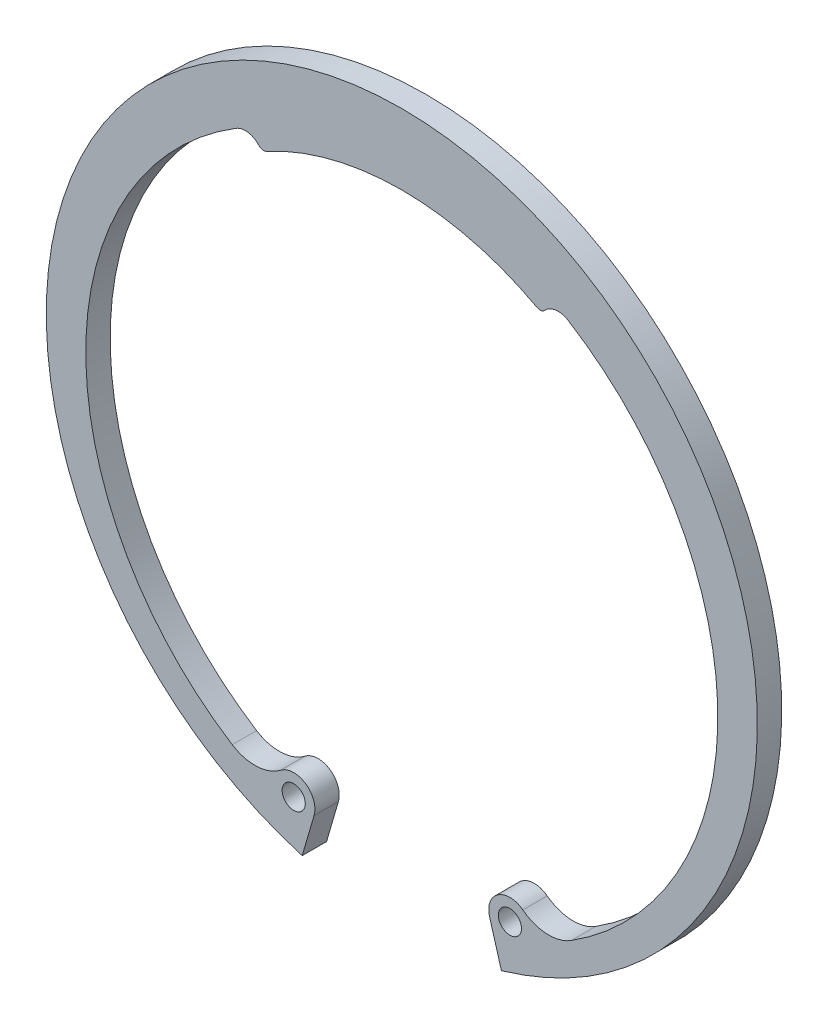
ISO-10303-21;
HEADER;
FILE_DESCRIPTION(('STEP AP214'),'2;1');
FILE_NAME('part.step','',(''),(''),'','','');
FILE_SCHEMA(('AUTOMOTIVE_DESIGN { 1 0 10303 214 1 1 1 1 }'));
ENDSEC;
DATA;
#1=APPLICATION_CONTEXT('core data for automotive mechanical design processes');
#2=APPLICATION_PROTOCOL_DEFINITION('international standard','automotive_design',2000,#1);
#3=PRODUCT_CONTEXT('',#1,'mechanical');
#4=PRODUCT('Part','Part','',(#3));
#5=PRODUCT_RELATED_PRODUCT_CATEGORY('part','',(#4));
#6=PRODUCT_DEFINITION_FORMATION('','',#4);
#7=PRODUCT_DEFINITION_CONTEXT('part definition',#1,'design');
#8=PRODUCT_DEFINITION('design','',#6,#7);
#9=PRODUCT_DEFINITION_SHAPE('','',#8);
#10=(LENGTH_UNIT() NAMED_UNIT(*) SI_UNIT(.MILLI.,.METRE.));
#11=(NAMED_UNIT(*) PLANE_ANGLE_UNIT() SI_UNIT($,.RADIAN.));
#12=(NAMED_UNIT(*) SI_UNIT($,.STERADIAN.) SOLID_ANGLE_UNIT());
#13=UNCERTAINTY_MEASURE_WITH_UNIT(LENGTH_MEASURE(1.E-05),#10,'distance_accuracy_value','');
#14=(GEOMETRIC_REPRESENTATION_CONTEXT(3) GLOBAL_UNCERTAINTY_ASSIGNED_CONTEXT((#13)) GLOBAL_UNIT_ASSIGNED_CONTEXT((#10,
#11,#12)) REPRESENTATION_CONTEXT('',''));
#15=CARTESIAN_POINT('',(0.,0.,0.));
#16=DIRECTION('',(0.,0.,1.));
#17=DIRECTION('',(1.,0.,0.));
#18=AXIS2_PLACEMENT_3D('',#15,#16,#17);
#19=CARTESIAN_POINT('',(0.,-2.21438908593819,4.));
#20=DIRECTION('',(0.,0.,-1.));
#21=DIRECTION('',(-1.,0.,0.));
#22=AXIS2_PLACEMENT_3D('',#19,#20,#21);
#23=CYLINDRICAL_SURFACE('',#22,51.8643890859382);
#24=CARTESIAN_POINT('',(0.,-2.21438908593819,0.));
#25=DIRECTION('',(0.,0.,-1.));
#26=DIRECTION('',(1.,0.,0.));
#27=AXIS2_PLACEMENT_3D('',#24,#25,#26);
#28=CIRCLE('',#27,51.8643890859382);
#29=CARTESIAN_POINT('',(-27.8304508915466,-45.9794534458908,0.));
#30=VERTEX_POINT('',#29);
#31=CARTESIAN_POINT('',(-27.2461818814489,41.9167838889623,0.));
#32=VERTEX_POINT('',#31);
#33=EDGE_CURVE('E249',#30,#32,#28,.T.);
#34=ORIENTED_EDGE('',*,*,#33,.T.);
#35=DIRECTION('',(0.,0.,-1.));
#36=VECTOR('',#35,1.);
#37=CARTESIAN_POINT('',(-27.2461818814489,41.9167838889623,4.));
#38=LINE('',#37,#36);
#39=CARTESIAN_POINT('',(-27.2461818814489,41.9167838889623,4.));
#40=VERTEX_POINT('',#39);
#41=EDGE_CURVE('E177',#32,#40,#38,.F.);
#42=ORIENTED_EDGE('',*,*,#41,.T.);
#43=CARTESIAN_POINT('',(0.,-2.21438908593819,4.));
#44=DIRECTION('',(0.,0.,-1.));
#45=DIRECTION('',(1.,0.,0.));
#46=AXIS2_PLACEMENT_3D('',#43,#44,#45);
#47=CIRCLE('',#46,51.8643890859382);
#48=CARTESIAN_POINT('',(-27.8304508915466,-45.9794534458908,4.));
#49=VERTEX_POINT('',#48);
#50=EDGE_CURVE('E248',#49,#40,#47,.T.);
#51=ORIENTED_EDGE('',*,*,#50,.F.);
#52=DIRECTION('',(0.,0.,-1.));
#53=VECTOR('',#52,1.);
#54=CARTESIAN_POINT('',(-27.8304508915466,-45.9794534458908,4.));
#55=LINE('',#54,#53);
#56=EDGE_CURVE('E307',#49,#30,#55,.T.);
#57=ORIENTED_EDGE('',*,*,#56,.T.);
#58=EDGE_LOOP('',(#34,#42,#51,#57));
#59=FACE_BOUND('',#58,.T.);
#60=ADVANCED_FACE('F44',(#59),#23,.F.);
#61=CARTESIAN_POINT('',(0.,0.,4.));
#62=DIRECTION('',(0.,0.,1.));
#63=DIRECTION('',(1.,0.,0.));
#64=AXIS2_PLACEMENT_3D('',#61,#62,#63);
#65=PLANE('',#64);
#66=CARTESIAN_POINT('',(17.740527432389,-48.3745729843753,4.));
#67=DIRECTION('',(0.,0.,1.));
#68=DIRECTION('',(1.,0.,0.));
#69=AXIS2_PLACEMENT_3D('',#66,#67,#68);
#70=CIRCLE('',#69,1.9);
#71=CARTESIAN_POINT('',(19.640527432389,-48.3745729843753,4.));
#72=VERTEX_POINT('',#71);
#73=EDGE_CURVE('E273',#72,#72,#70,.T.);
#74=ORIENTED_EDGE('',*,*,#73,.F.);
#75=EDGE_LOOP('',(#74));
#76=FACE_BOUND('',#75,.T.);
#77=CARTESIAN_POINT('',(-25.6701767055486,39.3640975224975,4.));
#78=DIRECTION('',(0.,0.,1.));
#79=DIRECTION('',(1.,0.,0.));
#80=AXIS2_PLACEMENT_3D('',#77,#78,#79);
#81=CIRCLE('',#80,3.);
#82=CARTESIAN_POINT('',(-23.441673777115,41.3725234479334,4.));
#83=VERTEX_POINT('',#82);
#84=EDGE_CURVE('E194',#40,#83,#81,.F.);
#85=ORIENTED_EDGE('',*,*,#84,.T.);
#86=CARTESIAN_POINT('',(-22.6988394676372,42.041998756412,4.));
#87=DIRECTION('',(0.,0.,1.));
#88=DIRECTION('',(1.,0.,0.));
#89=AXIS2_PLACEMENT_3D('',#86,#87,#88);
#90=CIRCLE('',#89,1.);
#91=CARTESIAN_POINT('',(-22.2237527779086,41.1620597600931,4.));
#92=VERTEX_POINT('',#91);
#93=EDGE_CURVE('E53',#83,#92,#90,.T.);
#94=ORIENTED_EDGE('',*,*,#93,.T.);
#95=CARTESIAN_POINT('',(0.,0.,4.));
#96=DIRECTION('',(0.,0.,1.));
#97=DIRECTION('',(1.,0.,0.));
#98=AXIS2_PLACEMENT_3D('',#95,#96,#97);
#99=CIRCLE('',#98,46.7783106923185);
#100=CARTESIAN_POINT('',(22.2237527779086,41.1620597600932,4.));
#101=VERTEX_POINT('',#100);
#102=EDGE_CURVE('E224',#101,#92,#99,.T.);
#103=ORIENTED_EDGE('',*,*,#102,.F.);
#104=CARTESIAN_POINT('',(22.6988394676372,42.0419987564121,4.));
#105=DIRECTION('',(0.,0.,1.));
#106=DIRECTION('',(1.,0.,0.));
#107=AXIS2_PLACEMENT_3D('',#104,#105,#106);
#108=CIRCLE('',#107,1.);
#109=CARTESIAN_POINT('',(23.441673777115,41.3725234479334,4.));
#110=VERTEX_POINT('',#109);
#111=EDGE_CURVE('E60',#101,#110,#108,.T.);
#112=ORIENTED_EDGE('',*,*,#111,.T.);
#113=CARTESIAN_POINT('',(25.6701767055486,39.3640975224975,4.));
#114=DIRECTION('',(0.,0.,1.));
#115=DIRECTION('',(1.,0.,0.));
#116=AXIS2_PLACEMENT_3D('',#113,#114,#115);
#117=CIRCLE('',#116,3.);
#118=CARTESIAN_POINT('',(27.2461818814489,41.9167838889623,4.));
#119=VERTEX_POINT('',#118);
#120=EDGE_CURVE('E201',#110,#119,#117,.F.);
#121=ORIENTED_EDGE('',*,*,#120,.T.);
#122=CARTESIAN_POINT('',(27.8304508915466,-45.9794534458908,4.));
#123=VERTEX_POINT('',#122);
#124=EDGE_CURVE('E255',#119,#123,#47,.T.);
#125=ORIENTED_EDGE('',*,*,#124,.T.);
#126=CARTESIAN_POINT('',(24.101078250605,-40.1147897978206,4.));
#127=DIRECTION('',(0.,0.,-1.));
#128=DIRECTION('',(1.,0.,0.));
#129=AXIS2_PLACEMENT_3D('',#126,#127,#128);
#130=CIRCLE('',#129,6.94999999999999);
#131=CARTESIAN_POINT('',(19.860711038461,-45.6213119221904,4.));
#132=VERTEX_POINT('',#131);
#133=EDGE_CURVE('E254',#123,#132,#130,.T.);
#134=ORIENTED_EDGE('',*,*,#133,.T.);
#135=CARTESIAN_POINT('',(17.740527432389,-48.3745729843753,4.));
#136=DIRECTION('',(0.,0.,1.));
#137=DIRECTION('',(1.,0.,0.));
#138=AXIS2_PLACEMENT_3D('',#135,#136,#137);
#139=CIRCLE('',#138,3.475);
#140=CARTESIAN_POINT('',(14.4047361992826,-49.3482884711221,4.));
#141=VERTEX_POINT('',#140);
#142=EDGE_CURVE('E260',#132,#141,#139,.T.);
#143=ORIENTED_EDGE('',*,*,#142,.T.);
#144=DIRECTION('',(0.280205895466689,-0.959939923196088,0.));
#145=VECTOR('',#144,1.);
#146=CARTESIAN_POINT('',(16.3500140004813,-56.0124945184917,4.));
#147=LINE('',#146,#145);
#148=CARTESIAN_POINT('',(16.3500140004813,-56.0124945184917,4.));
#149=VERTEX_POINT('',#148);
#150=EDGE_CURVE('E166',#141,#149,#147,.T.);
#151=ORIENTED_EDGE('',*,*,#150,.T.);
#152=CARTESIAN_POINT('',(0.,0.,4.));
#153=DIRECTION('',(0.,0.,1.));
#154=DIRECTION('',(1.,0.,0.));
#155=AXIS2_PLACEMENT_3D('',#152,#153,#154);
#156=CIRCLE('',#155,58.35);
#157=CARTESIAN_POINT('',(-16.3500140004813,-56.0124945184917,4.));
#158=VERTEX_POINT('',#157);
#159=EDGE_CURVE('E160',#149,#158,#156,.T.);
#160=ORIENTED_EDGE('',*,*,#159,.T.);
#161=DIRECTION('',(0.280205895466688,0.959939923196088,0.));
#162=VECTOR('',#161,1.);
#163=CARTESIAN_POINT('',(-16.3500140004813,-56.0124945184917,4.));
#164=LINE('',#163,#162);
#165=CARTESIAN_POINT('',(-14.4047361992826,-49.3482884711221,4.));
#166=VERTEX_POINT('',#165);
#167=EDGE_CURVE('E149',#158,#166,#164,.T.);
#168=ORIENTED_EDGE('',*,*,#167,.T.);
#169=CARTESIAN_POINT('',(-17.740527432389,-48.3745729843753,4.));
#170=DIRECTION('',(0.,0.,1.));
#171=DIRECTION('',(1.,0.,0.));
#172=AXIS2_PLACEMENT_3D('',#169,#170,#171);
#173=CIRCLE('',#172,3.475);
#174=CARTESIAN_POINT('',(-19.860711038461,-45.6213119221904,4.));
#175=VERTEX_POINT('',#174);
#176=EDGE_CURVE('E159',#166,#175,#173,.T.);
#177=ORIENTED_EDGE('',*,*,#176,.T.);
#178=CARTESIAN_POINT('',(-24.101078250605,-40.1147897978206,4.));
#179=DIRECTION('',(0.,0.,-1.));
#180=DIRECTION('',(1.,0.,0.));
#181=AXIS2_PLACEMENT_3D('',#178,#179,#180);
#182=CIRCLE('',#181,6.95);
#183=EDGE_CURVE('E251',#175,#49,#182,.T.);
#184=ORIENTED_EDGE('',*,*,#183,.T.);
#185=ORIENTED_EDGE('',*,*,#50,.T.);
#186=EDGE_LOOP('',(#85,#94,#103,#112,#121,#125,#134,#143,#151,#160,#168,#177,#184,#185));
#187=FACE_BOUND('',#186,.T.);
#188=CARTESIAN_POINT('',(-17.740527432389,-48.3745729843753,4.));
#189=DIRECTION('',(0.,0.,1.));
#190=DIRECTION('',(1.,0.,0.));
#191=AXIS2_PLACEMENT_3D('',#188,#189,#190);
#192=CIRCLE('',#191,1.9);
#193=CARTESIAN_POINT('',(-15.840527432389,-48.3745729843753,4.));
#194=VERTEX_POINT('',#193);
#195=EDGE_CURVE('E327',#194,#194,#192,.T.);
#196=ORIENTED_EDGE('',*,*,#195,.F.);
#197=EDGE_LOOP('',(#196));
#198=FACE_BOUND('',#197,.T.);
#199=ADVANCED_FACE('F163',(#76,#187,#198),#65,.T.);
#200=CARTESIAN_POINT('',(0.,0.,0.));
#201=DIRECTION('',(0.,0.,1.));
#202=DIRECTION('',(1.,0.,0.));
#203=AXIS2_PLACEMENT_3D('',#200,#201,#202);
#204=PLANE('',#203);
#205=CARTESIAN_POINT('',(17.740527432389,-48.3745729843753,0.));
#206=DIRECTION('',(0.,0.,1.));
#207=DIRECTION('',(1.,0.,0.));
#208=AXIS2_PLACEMENT_3D('',#205,#206,#207);
#209=CIRCLE('',#208,1.9);
#210=CARTESIAN_POINT('',(19.640527432389,-48.3745729843753,0.));
#211=VERTEX_POINT('',#210);
#212=EDGE_CURVE('E323',#211,#211,#209,.T.);
#213=ORIENTED_EDGE('',*,*,#212,.T.);
#214=EDGE_LOOP('',(#213));
#215=FACE_BOUND('',#214,.T.);
#216=CARTESIAN_POINT('',(0.,0.,0.));
#217=DIRECTION('',(0.,0.,1.));
#218=DIRECTION('',(-1.,0.,0.));
#219=AXIS2_PLACEMENT_3D('',#216,#217,#218);
#220=CIRCLE('',#219,46.7783106923185);
#221=CARTESIAN_POINT('',(22.2237527779086,41.1620597600932,0.));
#222=VERTEX_POINT('',#221);
#223=CARTESIAN_POINT('',(-22.2237527779086,41.1620597600931,0.));
#224=VERTEX_POINT('',#223);
#225=EDGE_CURVE('E235',#222,#224,#220,.T.);
#226=ORIENTED_EDGE('',*,*,#225,.T.);
#227=CARTESIAN_POINT('',(-22.6988394676372,42.041998756412,0.));
#228=DIRECTION('',(0.,0.,1.));
#229=DIRECTION('',(1.,0.,0.));
#230=AXIS2_PLACEMENT_3D('',#227,#228,#229);
#231=CIRCLE('',#230,1.);
#232=CARTESIAN_POINT('',(-23.441673777115,41.3725234479334,0.));
#233=VERTEX_POINT('',#232);
#234=EDGE_CURVE('E214',#224,#233,#231,.F.);
#235=ORIENTED_EDGE('',*,*,#234,.T.);
#236=CARTESIAN_POINT('',(-25.6701767055486,39.3640975224975,0.));
#237=DIRECTION('',(0.,0.,1.));
#238=DIRECTION('',(1.,0.,0.));
#239=AXIS2_PLACEMENT_3D('',#236,#237,#238);
#240=CIRCLE('',#239,3.);
#241=EDGE_CURVE('E191',#233,#32,#240,.T.);
#242=ORIENTED_EDGE('',*,*,#241,.T.);
#243=ORIENTED_EDGE('',*,*,#33,.F.);
#244=CARTESIAN_POINT('',(-24.101078250605,-40.1147897978206,0.));
#245=DIRECTION('',(0.,0.,-1.));
#246=DIRECTION('',(1.,0.,0.));
#247=AXIS2_PLACEMENT_3D('',#244,#245,#246);
#248=CIRCLE('',#247,6.95);
#249=CARTESIAN_POINT('',(-19.860711038461,-45.6213119221904,0.));
#250=VERTEX_POINT('',#249);
#251=EDGE_CURVE('E279',#250,#30,#248,.T.);
#252=ORIENTED_EDGE('',*,*,#251,.F.);
#253=CARTESIAN_POINT('',(-17.740527432389,-48.3745729843753,0.));
#254=DIRECTION('',(0.,0.,1.));
#255=DIRECTION('',(1.,0.,0.));
#256=AXIS2_PLACEMENT_3D('',#253,#254,#255);
#257=CIRCLE('',#256,3.475);
#258=CARTESIAN_POINT('',(-14.4047361992826,-49.3482884711221,0.));
#259=VERTEX_POINT('',#258);
#260=EDGE_CURVE('E276',#259,#250,#257,.T.);
#261=ORIENTED_EDGE('',*,*,#260,.F.);
#262=DIRECTION('',(0.280205895466688,0.959939923196088,0.));
#263=VECTOR('',#262,1.);
#264=CARTESIAN_POINT('',(-16.3500140004813,-56.0124945184917,0.));
#265=LINE('',#264,#263);
#266=CARTESIAN_POINT('',(-16.3500140004813,-56.0124945184917,0.));
#267=VERTEX_POINT('',#266);
#268=EDGE_CURVE('E272',#267,#259,#265,.T.);
#269=ORIENTED_EDGE('',*,*,#268,.F.);
#270=CARTESIAN_POINT('',(0.,0.,0.));
#271=DIRECTION('',(0.,0.,1.));
#272=DIRECTION('',(1.,0.,0.));
#273=AXIS2_PLACEMENT_3D('',#270,#271,#272);
#274=CIRCLE('',#273,58.35);
#275=CARTESIAN_POINT('',(16.3500140004813,-56.0124945184917,0.));
#276=VERTEX_POINT('',#275);
#277=EDGE_CURVE('E175',#276,#267,#274,.T.);
#278=ORIENTED_EDGE('',*,*,#277,.F.);
#279=DIRECTION('',(0.280205895466689,-0.959939923196088,0.));
#280=VECTOR('',#279,1.);
#281=CARTESIAN_POINT('',(16.3500140004813,-56.0124945184917,0.));
#282=LINE('',#281,#280);
#283=CARTESIAN_POINT('',(14.4047361992826,-49.3482884711221,0.));
#284=VERTEX_POINT('',#283);
#285=EDGE_CURVE('E171',#284,#276,#282,.T.);
#286=ORIENTED_EDGE('',*,*,#285,.F.);
#287=CARTESIAN_POINT('',(17.740527432389,-48.3745729843753,0.));
#288=DIRECTION('',(0.,0.,1.));
#289=DIRECTION('',(1.,0.,0.));
#290=AXIS2_PLACEMENT_3D('',#287,#288,#289);
#291=CIRCLE('',#290,3.475);
#292=CARTESIAN_POINT('',(19.860711038461,-45.6213119221904,0.));
#293=VERTEX_POINT('',#292);
#294=EDGE_CURVE('E288',#293,#284,#291,.T.);
#295=ORIENTED_EDGE('',*,*,#294,.F.);
#296=CARTESIAN_POINT('',(24.101078250605,-40.1147897978206,0.));
#297=DIRECTION('',(0.,0.,-1.));
#298=DIRECTION('',(1.,0.,0.));
#299=AXIS2_PLACEMENT_3D('',#296,#297,#298);
#300=CIRCLE('',#299,6.94999999999999);
#301=CARTESIAN_POINT('',(27.8304508915466,-45.9794534458908,0.));
#302=VERTEX_POINT('',#301);
#303=EDGE_CURVE('E285',#302,#293,#300,.T.);
#304=ORIENTED_EDGE('',*,*,#303,.F.);
#305=CARTESIAN_POINT('',(27.2461818814489,41.9167838889623,0.));
#306=VERTEX_POINT('',#305);
#307=EDGE_CURVE('E282',#306,#302,#28,.T.);
#308=ORIENTED_EDGE('',*,*,#307,.F.);
#309=CARTESIAN_POINT('',(25.6701767055486,39.3640975224975,0.));
#310=DIRECTION('',(0.,0.,1.));
#311=DIRECTION('',(1.,0.,0.));
#312=AXIS2_PLACEMENT_3D('',#309,#310,#311);
#313=CIRCLE('',#312,3.);
#314=CARTESIAN_POINT('',(23.441673777115,41.3725234479334,0.));
#315=VERTEX_POINT('',#314);
#316=EDGE_CURVE('E197',#306,#315,#313,.T.);
#317=ORIENTED_EDGE('',*,*,#316,.T.);
#318=CARTESIAN_POINT('',(22.6988394676372,42.0419987564121,0.));
#319=DIRECTION('',(0.,0.,1.));
#320=DIRECTION('',(1.,0.,0.));
#321=AXIS2_PLACEMENT_3D('',#318,#319,#320);
#322=CIRCLE('',#321,1.);
#323=EDGE_CURVE('E211',#315,#222,#322,.F.);
#324=ORIENTED_EDGE('',*,*,#323,.T.);
#325=EDGE_LOOP('',(#226,#235,#242,#243,#252,#261,#269,#278,#286,#295,#304,#308,#317,#324));
#326=FACE_BOUND('',#325,.T.);
#327=CARTESIAN_POINT('',(-17.740527432389,-48.3745729843753,0.));
#328=DIRECTION('',(0.,0.,1.));
#329=DIRECTION('',(1.,0.,0.));
#330=AXIS2_PLACEMENT_3D('',#327,#328,#329);
#331=CIRCLE('',#330,1.9);
#332=CARTESIAN_POINT('',(-15.840527432389,-48.3745729843753,0.));
#333=VERTEX_POINT('',#332);
#334=EDGE_CURVE('E234',#333,#333,#331,.T.);
#335=ORIENTED_EDGE('',*,*,#334,.T.);
#336=EDGE_LOOP('',(#335));
#337=FACE_BOUND('',#336,.T.);
#338=ADVANCED_FACE('F239',(#215,#326,#337),#204,.F.);
#339=CARTESIAN_POINT('',(0.,0.,4.));
#340=DIRECTION('',(0.,0.,-1.));
#341=DIRECTION('',(-1.,0.,0.));
#342=AXIS2_PLACEMENT_3D('',#339,#340,#341);
#343=CYLINDRICAL_SURFACE('',#342,58.35);
#344=ORIENTED_EDGE('',*,*,#277,.T.);
#345=DIRECTION('',(0.,0.,-1.));
#346=VECTOR('',#345,1.);
#347=CARTESIAN_POINT('',(-16.3500140004813,-56.0124945184917,4.));
#348=LINE('',#347,#346);
#349=EDGE_CURVE('E153',#158,#267,#348,.T.);
#350=ORIENTED_EDGE('',*,*,#349,.F.);
#351=ORIENTED_EDGE('',*,*,#159,.F.);
#352=DIRECTION('',(0.,0.,-1.));
#353=VECTOR('',#352,1.);
#354=CARTESIAN_POINT('',(16.3500140004813,-56.0124945184917,4.));
#355=LINE('',#354,#353);
#356=EDGE_CURVE('E269',#149,#276,#355,.T.);
#357=ORIENTED_EDGE('',*,*,#356,.T.);
#358=EDGE_LOOP('',(#344,#350,#351,#357));
#359=FACE_BOUND('',#358,.T.);
#360=ADVANCED_FACE('F173',(#359),#343,.T.);
#361=CARTESIAN_POINT('',(-16.3500140004813,-56.0124945184917,4.));
#362=DIRECTION('',(-0.959939923196088,0.280205895466688,0.));
#363=DIRECTION('',(-0.280205895466688,-0.959939923196088,0.));
#364=AXIS2_PLACEMENT_3D('',#361,#362,#363);
#365=PLANE('',#364);
#366=ORIENTED_EDGE('',*,*,#268,.T.);
#367=DIRECTION('',(0.,0.,-1.));
#368=VECTOR('',#367,1.);
#369=CARTESIAN_POINT('',(-14.4047361992826,-49.3482884711221,4.));
#370=LINE('',#369,#368);
#371=EDGE_CURVE('E156',#166,#259,#370,.T.);
#372=ORIENTED_EDGE('',*,*,#371,.F.);
#373=ORIENTED_EDGE('',*,*,#167,.F.);
#374=ORIENTED_EDGE('',*,*,#349,.T.);
#375=EDGE_LOOP('',(#366,#372,#373,#374));
#376=FACE_BOUND('',#375,.T.);
#377=ADVANCED_FACE('F151',(#376),#365,.F.);
#378=CARTESIAN_POINT('',(-17.740527432389,-48.3745729843753,4.));
#379=DIRECTION('',(0.,0.,-1.));
#380=DIRECTION('',(-1.,0.,0.));
#381=AXIS2_PLACEMENT_3D('',#378,#379,#380);
#382=CYLINDRICAL_SURFACE('',#381,3.475);
#383=ORIENTED_EDGE('',*,*,#260,.T.);
#384=DIRECTION('',(0.,0.,-1.));
#385=VECTOR('',#384,1.);
#386=CARTESIAN_POINT('',(-19.860711038461,-45.6213119221904,4.));
#387=LINE('',#386,#385);
#388=EDGE_CURVE('E184',#175,#250,#387,.T.);
#389=ORIENTED_EDGE('',*,*,#388,.F.);
#390=ORIENTED_EDGE('',*,*,#176,.F.);
#391=ORIENTED_EDGE('',*,*,#371,.T.);
#392=EDGE_LOOP('',(#383,#389,#390,#391));
#393=FACE_BOUND('',#392,.T.);
#394=ADVANCED_FACE('F318',(#393),#382,.T.);
#395=CARTESIAN_POINT('',(-24.101078250605,-40.1147897978206,4.));
#396=DIRECTION('',(0.,0.,-1.));
#397=DIRECTION('',(-1.,0.,0.));
#398=AXIS2_PLACEMENT_3D('',#395,#396,#397);
#399=CYLINDRICAL_SURFACE('',#398,6.95);
#400=ORIENTED_EDGE('',*,*,#251,.T.);
#401=ORIENTED_EDGE('',*,*,#56,.F.);
#402=ORIENTED_EDGE('',*,*,#183,.F.);
#403=ORIENTED_EDGE('',*,*,#388,.T.);
#404=EDGE_LOOP('',(#400,#401,#402,#403));
#405=FACE_BOUND('',#404,.T.);
#406=ADVANCED_FACE('F315',(#405),#399,.F.);
#407=ORIENTED_EDGE('',*,*,#124,.F.);
#408=DIRECTION('',(0.,0.,-1.));
#409=VECTOR('',#408,1.);
#410=CARTESIAN_POINT('',(27.2461818814489,41.9167838889623,4.));
#411=LINE('',#410,#409);
#412=EDGE_CURVE('E182',#119,#306,#411,.T.);
#413=ORIENTED_EDGE('',*,*,#412,.T.);
#414=ORIENTED_EDGE('',*,*,#307,.T.);
#415=DIRECTION('',(0.,0.,-1.));
#416=VECTOR('',#415,1.);
#417=CARTESIAN_POINT('',(27.8304508915466,-45.9794534458908,4.));
#418=LINE('',#417,#416);
#419=EDGE_CURVE('E303',#123,#302,#418,.T.);
#420=ORIENTED_EDGE('',*,*,#419,.F.);
#421=EDGE_LOOP('',(#407,#413,#414,#420));
#422=FACE_BOUND('',#421,.T.);
#423=ADVANCED_FACE('F360',(#422),#23,.F.);
#424=CARTESIAN_POINT('',(24.101078250605,-40.1147897978206,4.));
#425=DIRECTION('',(0.,0.,-1.));
#426=DIRECTION('',(-1.,0.,0.));
#427=AXIS2_PLACEMENT_3D('',#424,#425,#426);
#428=CYLINDRICAL_SURFACE('',#427,6.94999999999999);
#429=ORIENTED_EDGE('',*,*,#303,.T.);
#430=DIRECTION('',(0.,0.,-1.));
#431=VECTOR('',#430,1.);
#432=CARTESIAN_POINT('',(19.860711038461,-45.6213119221904,4.));
#433=LINE('',#432,#431);
#434=EDGE_CURVE('E299',#132,#293,#433,.T.);
#435=ORIENTED_EDGE('',*,*,#434,.F.);
#436=ORIENTED_EDGE('',*,*,#133,.F.);
#437=ORIENTED_EDGE('',*,*,#419,.T.);
#438=EDGE_LOOP('',(#429,#435,#436,#437));
#439=FACE_BOUND('',#438,.T.);
#440=ADVANCED_FACE('F365',(#439),#428,.F.);
#441=CARTESIAN_POINT('',(17.740527432389,-48.3745729843753,4.));
#442=DIRECTION('',(0.,0.,-1.));
#443=DIRECTION('',(-1.,0.,0.));
#444=AXIS2_PLACEMENT_3D('',#441,#442,#443);
#445=CYLINDRICAL_SURFACE('',#444,3.475);
#446=ORIENTED_EDGE('',*,*,#294,.T.);
#447=DIRECTION('',(0.,0.,-1.));
#448=VECTOR('',#447,1.);
#449=CARTESIAN_POINT('',(14.4047361992826,-49.3482884711221,4.));
#450=LINE('',#449,#448);
#451=EDGE_CURVE('E295',#141,#284,#450,.T.);
#452=ORIENTED_EDGE('',*,*,#451,.F.);
#453=ORIENTED_EDGE('',*,*,#142,.F.);
#454=ORIENTED_EDGE('',*,*,#434,.T.);
#455=EDGE_LOOP('',(#446,#452,#453,#454));
#456=FACE_BOUND('',#455,.T.);
#457=ADVANCED_FACE('F371',(#456),#445,.T.);
#458=CARTESIAN_POINT('',(16.3500140004813,-56.0124945184917,4.));
#459=DIRECTION('',(0.959939923196088,0.280205895466689,0.));
#460=DIRECTION('',(-0.280205895466689,0.959939923196088,0.));
#461=AXIS2_PLACEMENT_3D('',#458,#459,#460);
#462=PLANE('',#461);
#463=ORIENTED_EDGE('',*,*,#285,.T.);
#464=ORIENTED_EDGE('',*,*,#356,.F.);
#465=ORIENTED_EDGE('',*,*,#150,.F.);
#466=ORIENTED_EDGE('',*,*,#451,.T.);
#467=EDGE_LOOP('',(#463,#464,#465,#466));
#468=FACE_BOUND('',#467,.T.);
#469=ADVANCED_FACE('F374',(#468),#462,.F.);
#470=CARTESIAN_POINT('',(17.740527432389,-48.3745729843753,4.));
#471=DIRECTION('',(0.,0.,-1.));
#472=DIRECTION('',(-1.,0.,0.));
#473=AXIS2_PLACEMENT_3D('',#470,#471,#472);
#474=CYLINDRICAL_SURFACE('',#473,1.9);
#475=ORIENTED_EDGE('',*,*,#73,.T.);
#476=EDGE_LOOP('',(#475));
#477=FACE_BOUND('',#476,.T.);
#478=ORIENTED_EDGE('',*,*,#212,.F.);
#479=EDGE_LOOP('',(#478));
#480=FACE_BOUND('',#479,.T.);
#481=ADVANCED_FACE('F376',(#477,#480),#474,.F.);
#482=CARTESIAN_POINT('',(-17.740527432389,-48.3745729843753,4.));
#483=DIRECTION('',(0.,0.,-1.));
#484=DIRECTION('',(-1.,0.,0.));
#485=AXIS2_PLACEMENT_3D('',#482,#483,#484);
#486=CYLINDRICAL_SURFACE('',#485,1.9);
#487=ORIENTED_EDGE('',*,*,#195,.T.);
#488=EDGE_LOOP('',(#487));
#489=FACE_BOUND('',#488,.T.);
#490=ORIENTED_EDGE('',*,*,#334,.F.);
#491=EDGE_LOOP('',(#490));
#492=FACE_BOUND('',#491,.T.);
#493=ADVANCED_FACE('F382',(#489,#492),#486,.F.);
#494=CARTESIAN_POINT('',(0.,0.,53.8046749957856));
#495=DIRECTION('',(0.,0.,-1.));
#496=DIRECTION('',(-1.,0.,0.));
#497=AXIS2_PLACEMENT_3D('',#494,#495,#496);
#498=CYLINDRICAL_SURFACE('',#497,46.7783106923185);
#499=ORIENTED_EDGE('',*,*,#102,.T.);
#500=DIRECTION('',(0.,0.,-1.));
#501=VECTOR('',#500,1.);
#502=CARTESIAN_POINT('',(-22.2237527779086,41.1620597600931,53.8046749957856));
#503=LINE('',#502,#501);
#504=EDGE_CURVE('E207',#92,#224,#503,.T.);
#505=ORIENTED_EDGE('',*,*,#504,.T.);
#506=ORIENTED_EDGE('',*,*,#225,.F.);
#507=DIRECTION('',(0.,0.,-1.));
#508=VECTOR('',#507,1.);
#509=CARTESIAN_POINT('',(22.2237527779086,41.1620597600932,53.8046749957856));
#510=LINE('',#509,#508);
#511=EDGE_CURVE('E204',#222,#101,#510,.F.);
#512=ORIENTED_EDGE('',*,*,#511,.T.);
#513=EDGE_LOOP('',(#499,#505,#506,#512));
#514=FACE_BOUND('',#513,.T.);
#515=ADVANCED_FACE('F229',(#514),#498,.F.);
#516=CARTESIAN_POINT('',(-25.6701767055486,39.3640975224975,4.));
#517=DIRECTION('',(0.,0.,-1.));
#518=DIRECTION('',(-1.,0.,0.));
#519=AXIS2_PLACEMENT_3D('',#516,#517,#518);
#520=CYLINDRICAL_SURFACE('',#519,3.);
#521=ORIENTED_EDGE('',*,*,#241,.F.);
#522=DIRECTION('',(0.,0.,-1.));
#523=VECTOR('',#522,1.);
#524=CARTESIAN_POINT('',(-23.441673777115,41.3725234479334,4.));
#525=LINE('',#524,#523);
#526=EDGE_CURVE('E68',#233,#83,#525,.F.);
#527=ORIENTED_EDGE('',*,*,#526,.T.);
#528=ORIENTED_EDGE('',*,*,#84,.F.);
#529=ORIENTED_EDGE('',*,*,#41,.F.);
#530=EDGE_LOOP('',(#521,#527,#528,#529));
#531=FACE_BOUND('',#530,.T.);
#532=ADVANCED_FACE('F244',(#531),#520,.F.);
#533=CARTESIAN_POINT('',(25.6701767055486,39.3640975224975,4.));
#534=DIRECTION('',(0.,0.,-1.));
#535=DIRECTION('',(-1.,0.,0.));
#536=AXIS2_PLACEMENT_3D('',#533,#534,#535);
#537=CYLINDRICAL_SURFACE('',#536,3.);
#538=ORIENTED_EDGE('',*,*,#120,.F.);
#539=DIRECTION('',(0.,0.,-1.));
#540=VECTOR('',#539,1.);
#541=CARTESIAN_POINT('',(23.441673777115,41.3725234479334,4.));
#542=LINE('',#541,#540);
#543=EDGE_CURVE('E11',#110,#315,#542,.T.);
#544=ORIENTED_EDGE('',*,*,#543,.T.);
#545=ORIENTED_EDGE('',*,*,#316,.F.);
#546=ORIENTED_EDGE('',*,*,#412,.F.);
#547=EDGE_LOOP('',(#538,#544,#545,#546));
#548=FACE_BOUND('',#547,.T.);
#549=ADVANCED_FACE('F412',(#548),#537,.F.);
#550=CARTESIAN_POINT('',(-22.6988394676372,42.041998756412,4.));
#551=DIRECTION('',(0.,0.,-1.));
#552=DIRECTION('',(-1.,0.,0.));
#553=AXIS2_PLACEMENT_3D('',#550,#551,#552);
#554=CYLINDRICAL_SURFACE('',#553,1.);
#555=ORIENTED_EDGE('',*,*,#93,.F.);
#556=ORIENTED_EDGE('',*,*,#526,.F.);
#557=ORIENTED_EDGE('',*,*,#234,.F.);
#558=ORIENTED_EDGE('',*,*,#504,.F.);
#559=EDGE_LOOP('',(#555,#556,#557,#558));
#560=FACE_BOUND('',#559,.T.);
#561=ADVANCED_FACE('F237',(#560),#554,.T.);
#562=CARTESIAN_POINT('',(22.6988394676372,42.0419987564121,53.8046749957856));
#563=DIRECTION('',(0.,0.,-1.));
#564=DIRECTION('',(-1.,0.,0.));
#565=AXIS2_PLACEMENT_3D('',#562,#563,#564);
#566=CYLINDRICAL_SURFACE('',#565,1.);
#567=ORIENTED_EDGE('',*,*,#111,.F.);
#568=ORIENTED_EDGE('',*,*,#511,.F.);
#569=ORIENTED_EDGE('',*,*,#323,.F.);
#570=ORIENTED_EDGE('',*,*,#543,.F.);
#571=EDGE_LOOP('',(#567,#568,#569,#570));
#572=FACE_BOUND('',#571,.T.);
#573=ADVANCED_FACE('F46',(#572),#566,.T.);
#574=CLOSED_SHELL('',(#60,#199,#338,#360,#377,#394,#406,#423,#440,#457,#469,#481,#493,#515,#532,
#549,#561,#573));
#575=MANIFOLD_SOLID_BREP('B2',#574);
#576=ADVANCED_BREP_SHAPE_REPRESENTATION('',(#18,#575),#14);
#577=SHAPE_DEFINITION_REPRESENTATION(#9,#576);
ENDSEC;
END-ISO-10303-21;
